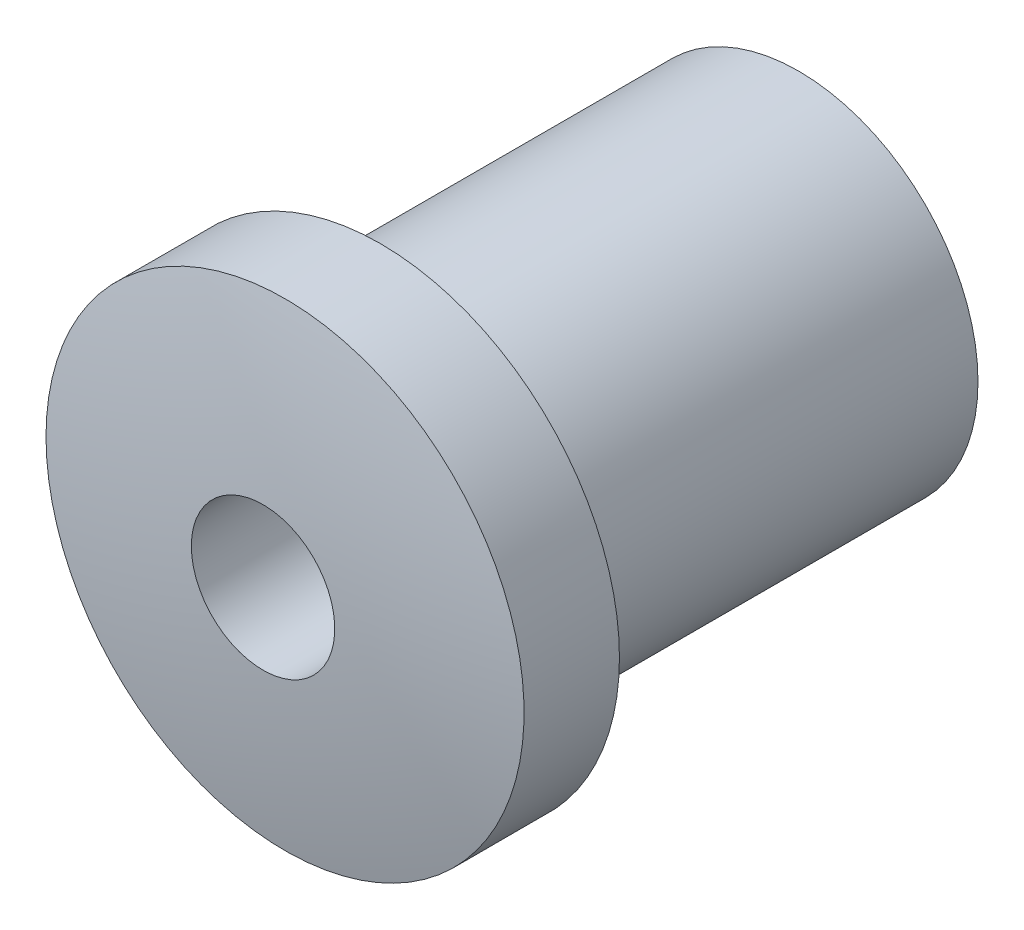
ISO-10303-21;
HEADER;
FILE_DESCRIPTION(('STEP AP214'),'2;1');
FILE_NAME('part.step','',(''),(''),'','','');
FILE_SCHEMA(('AUTOMOTIVE_DESIGN { 1 0 10303 214 1 1 1 1 }'));
ENDSEC;
DATA;
#1=APPLICATION_CONTEXT('core data for automotive mechanical design processes');
#2=APPLICATION_PROTOCOL_DEFINITION('international standard','automotive_design',2000,#1);
#3=PRODUCT_CONTEXT('',#1,'mechanical');
#4=PRODUCT('Part','Part','',(#3));
#5=PRODUCT_RELATED_PRODUCT_CATEGORY('part','',(#4));
#6=PRODUCT_DEFINITION_FORMATION('','',#4);
#7=PRODUCT_DEFINITION_CONTEXT('part definition',#1,'design');
#8=PRODUCT_DEFINITION('design','',#6,#7);
#9=PRODUCT_DEFINITION_SHAPE('','',#8);
#10=(LENGTH_UNIT() NAMED_UNIT(*) SI_UNIT(.MILLI.,.METRE.));
#11=(NAMED_UNIT(*) PLANE_ANGLE_UNIT() SI_UNIT($,.RADIAN.));
#12=(NAMED_UNIT(*) SI_UNIT($,.STERADIAN.) SOLID_ANGLE_UNIT());
#13=UNCERTAINTY_MEASURE_WITH_UNIT(LENGTH_MEASURE(1.E-05),#10,'distance_accuracy_value','');
#14=(GEOMETRIC_REPRESENTATION_CONTEXT(3) GLOBAL_UNCERTAINTY_ASSIGNED_CONTEXT((#13)) GLOBAL_UNIT_ASSIGNED_CONTEXT((#10,
#11,#12)) REPRESENTATION_CONTEXT('',''));
#15=CARTESIAN_POINT('',(0.,0.,0.));
#16=DIRECTION('',(0.,0.,1.));
#17=DIRECTION('',(1.,0.,0.));
#18=AXIS2_PLACEMENT_3D('',#15,#16,#17);
#19=CARTESIAN_POINT('',(0.,0.,35.));
#20=DIRECTION('',(0.,0.,-1.));
#21=DIRECTION('',(-1.,0.,0.));
#22=AXIS2_PLACEMENT_3D('',#19,#20,#21);
#23=CYLINDRICAL_SURFACE('',#22,15.);
#24=CARTESIAN_POINT('',(0.,0.,35.));
#25=DIRECTION('',(0.,0.,1.));
#26=DIRECTION('',(1.,0.,0.));
#27=AXIS2_PLACEMENT_3D('',#24,#25,#26);
#28=CIRCLE('',#27,15.);
#29=CARTESIAN_POINT('',(15.,0.,35.));
#30=VERTEX_POINT('',#29);
#31=EDGE_CURVE('E13',#30,#30,#28,.T.);
#32=ORIENTED_EDGE('',*,*,#31,.F.);
#33=EDGE_LOOP('',(#32));
#34=FACE_BOUND('',#33,.T.);
#35=CARTESIAN_POINT('',(0.,0.,0.));
#36=DIRECTION('',(0.,0.,1.));
#37=DIRECTION('',(1.,0.,0.));
#38=AXIS2_PLACEMENT_3D('',#35,#36,#37);
#39=CIRCLE('',#38,15.);
#40=CARTESIAN_POINT('',(15.,0.,0.));
#41=VERTEX_POINT('',#40);
#42=EDGE_CURVE('E56',#41,#41,#39,.T.);
#43=ORIENTED_EDGE('',*,*,#42,.T.);
#44=EDGE_LOOP('',(#43));
#45=FACE_BOUND('',#44,.T.);
#46=ADVANCED_FACE('F53',(#34,#45),#23,.T.);
#47=CARTESIAN_POINT('',(0.,0.,0.));
#48=DIRECTION('',(0.,0.,1.));
#49=DIRECTION('',(1.,0.,0.));
#50=AXIS2_PLACEMENT_3D('',#47,#48,#49);
#51=PLANE('',#50);
#52=DIRECTION('',(0.5,0.866025403784439,0.));
#53=VECTOR('',#52,1.);
#54=CARTESIAN_POINT('',(-11.0273901415219,0.,0.));
#55=LINE('',#54,#53);
#56=CARTESIAN_POINT('',(-11.0273901415219,0.,0.));
#57=VERTEX_POINT('',#56);
#58=CARTESIAN_POINT('',(-5.51369507076093,9.55,0.));
#59=VERTEX_POINT('',#58);
#60=EDGE_CURVE('E141',#57,#59,#55,.T.);
#61=ORIENTED_EDGE('',*,*,#60,.F.);
#62=DIRECTION('',(-0.5,0.866025403784439,0.));
#63=VECTOR('',#62,1.);
#64=CARTESIAN_POINT('',(-5.51369507076093,-9.55,0.));
#65=LINE('',#64,#63);
#66=CARTESIAN_POINT('',(-5.51369507076093,-9.55,0.));
#67=VERTEX_POINT('',#66);
#68=EDGE_CURVE('E67',#67,#57,#65,.T.);
#69=ORIENTED_EDGE('',*,*,#68,.F.);
#70=DIRECTION('',(-1.,0.,0.));
#71=VECTOR('',#70,1.);
#72=CARTESIAN_POINT('',(5.51369507076092,-9.55,0.));
#73=LINE('',#72,#71);
#74=CARTESIAN_POINT('',(5.51369507076092,-9.55,0.));
#75=VERTEX_POINT('',#74);
#76=EDGE_CURVE('E151',#75,#67,#73,.T.);
#77=ORIENTED_EDGE('',*,*,#76,.F.);
#78=DIRECTION('',(-0.5,-0.866025403784439,0.));
#79=VECTOR('',#78,1.);
#80=CARTESIAN_POINT('',(11.0273901415219,0.,0.));
#81=LINE('',#80,#79);
#82=CARTESIAN_POINT('',(11.0273901415219,0.,0.));
#83=VERTEX_POINT('',#82);
#84=EDGE_CURVE('E149',#83,#75,#81,.T.);
#85=ORIENTED_EDGE('',*,*,#84,.F.);
#86=DIRECTION('',(0.5,-0.866025403784438,0.));
#87=VECTOR('',#86,1.);
#88=CARTESIAN_POINT('',(5.51369507076093,9.55,0.));
#89=LINE('',#88,#87);
#90=CARTESIAN_POINT('',(5.51369507076093,9.55,0.));
#91=VERTEX_POINT('',#90);
#92=EDGE_CURVE('E115',#91,#83,#89,.T.);
#93=ORIENTED_EDGE('',*,*,#92,.F.);
#94=DIRECTION('',(1.,0.,0.));
#95=VECTOR('',#94,1.);
#96=CARTESIAN_POINT('',(-5.51369507076093,9.55,0.));
#97=LINE('',#96,#95);
#98=EDGE_CURVE('E145',#59,#91,#97,.T.);
#99=ORIENTED_EDGE('',*,*,#98,.F.);
#100=EDGE_LOOP('',(#61,#69,#77,#85,#93,#99));
#101=FACE_BOUND('',#100,.T.);
#102=ORIENTED_EDGE('',*,*,#42,.F.);
#103=EDGE_LOOP('',(#102));
#104=FACE_BOUND('',#103,.T.);
#105=ADVANCED_FACE('F164',(#101,#104),#51,.F.);
#106=CARTESIAN_POINT('',(-5.51369507076093,-9.55,12.));
#107=DIRECTION('',(-0.866025403784439,-0.5,0.));
#108=DIRECTION('',(0.5,-0.866025403784439,0.));
#109=AXIS2_PLACEMENT_3D('',#106,#107,#108);
#110=PLANE('',#109);
#111=ORIENTED_EDGE('',*,*,#68,.T.);
#112=DIRECTION('',(0.,0.,-1.));
#113=VECTOR('',#112,1.);
#114=CARTESIAN_POINT('',(-11.0273901415219,0.,12.));
#115=LINE('',#114,#113);
#116=CARTESIAN_POINT('',(-11.0273901415219,0.,12.));
#117=VERTEX_POINT('',#116);
#118=EDGE_CURVE('E97',#117,#57,#115,.T.);
#119=ORIENTED_EDGE('',*,*,#118,.F.);
#120=DIRECTION('',(-0.5,0.866025403784439,0.));
#121=VECTOR('',#120,1.);
#122=CARTESIAN_POINT('',(-5.51369507076093,-9.55,12.));
#123=LINE('',#122,#121);
#124=CARTESIAN_POINT('',(-5.51369507076093,-9.55,12.));
#125=VERTEX_POINT('',#124);
#126=EDGE_CURVE('E153',#125,#117,#123,.T.);
#127=ORIENTED_EDGE('',*,*,#126,.F.);
#128=DIRECTION('',(0.,0.,-1.));
#129=VECTOR('',#128,1.);
#130=CARTESIAN_POINT('',(-5.51369507076093,-9.55,12.));
#131=LINE('',#130,#129);
#132=EDGE_CURVE('E75',#125,#67,#131,.T.);
#133=ORIENTED_EDGE('',*,*,#132,.T.);
#134=EDGE_LOOP('',(#111,#119,#127,#133));
#135=FACE_BOUND('',#134,.T.);
#136=ADVANCED_FACE('F223',(#135),#110,.F.);
#137=CARTESIAN_POINT('',(5.51369507076092,-9.55,12.));
#138=DIRECTION('',(0.,-1.,0.));
#139=DIRECTION('',(0.,0.,-1.));
#140=AXIS2_PLACEMENT_3D('',#137,#138,#139);
#141=PLANE('',#140);
#142=ORIENTED_EDGE('',*,*,#76,.T.);
#143=ORIENTED_EDGE('',*,*,#132,.F.);
#144=DIRECTION('',(-1.,0.,0.));
#145=VECTOR('',#144,1.);
#146=CARTESIAN_POINT('',(5.51369507076092,-9.55,12.));
#147=LINE('',#146,#145);
#148=CARTESIAN_POINT('',(5.51369507076092,-9.55,12.));
#149=VERTEX_POINT('',#148);
#150=EDGE_CURVE('E127',#149,#125,#147,.T.);
#151=ORIENTED_EDGE('',*,*,#150,.F.);
#152=DIRECTION('',(0.,0.,-1.));
#153=VECTOR('',#152,1.);
#154=CARTESIAN_POINT('',(5.51369507076092,-9.55,12.));
#155=LINE('',#154,#153);
#156=EDGE_CURVE('E119',#149,#75,#155,.T.);
#157=ORIENTED_EDGE('',*,*,#156,.T.);
#158=EDGE_LOOP('',(#142,#143,#151,#157));
#159=FACE_BOUND('',#158,.T.);
#160=ADVANCED_FACE('F237',(#159),#141,.F.);
#161=CARTESIAN_POINT('',(11.0273901415219,0.,12.));
#162=DIRECTION('',(0.866025403784439,-0.5,0.));
#163=DIRECTION('',(0.5,0.866025403784439,0.));
#164=AXIS2_PLACEMENT_3D('',#161,#162,#163);
#165=PLANE('',#164);
#166=ORIENTED_EDGE('',*,*,#84,.T.);
#167=ORIENTED_EDGE('',*,*,#156,.F.);
#168=DIRECTION('',(-0.5,-0.866025403784439,0.));
#169=VECTOR('',#168,1.);
#170=CARTESIAN_POINT('',(11.0273901415219,0.,12.));
#171=LINE('',#170,#169);
#172=CARTESIAN_POINT('',(11.0273901415219,0.,12.));
#173=VERTEX_POINT('',#172);
#174=EDGE_CURVE('E123',#173,#149,#171,.T.);
#175=ORIENTED_EDGE('',*,*,#174,.F.);
#176=DIRECTION('',(0.,0.,-1.));
#177=VECTOR('',#176,1.);
#178=CARTESIAN_POINT('',(11.0273901415219,0.,12.));
#179=LINE('',#178,#177);
#180=EDGE_CURVE('E108',#173,#83,#179,.T.);
#181=ORIENTED_EDGE('',*,*,#180,.T.);
#182=EDGE_LOOP('',(#166,#167,#175,#181));
#183=FACE_BOUND('',#182,.T.);
#184=ADVANCED_FACE('F124',(#183),#165,.F.);
#185=CARTESIAN_POINT('',(5.51369507076093,9.55,12.));
#186=DIRECTION('',(0.866025403784439,0.5,0.));
#187=DIRECTION('',(-0.5,0.866025403784439,0.));
#188=AXIS2_PLACEMENT_3D('',#185,#186,#187);
#189=PLANE('',#188);
#190=ORIENTED_EDGE('',*,*,#92,.T.);
#191=ORIENTED_EDGE('',*,*,#180,.F.);
#192=DIRECTION('',(0.5,-0.866025403784438,0.));
#193=VECTOR('',#192,1.);
#194=CARTESIAN_POINT('',(5.51369507076093,9.55,12.));
#195=LINE('',#194,#193);
#196=CARTESIAN_POINT('',(5.51369507076093,9.55,12.));
#197=VERTEX_POINT('',#196);
#198=EDGE_CURVE('E112',#197,#173,#195,.T.);
#199=ORIENTED_EDGE('',*,*,#198,.F.);
#200=DIRECTION('',(0.,0.,-1.));
#201=VECTOR('',#200,1.);
#202=CARTESIAN_POINT('',(5.51369507076093,9.55,12.));
#203=LINE('',#202,#201);
#204=EDGE_CURVE('E120',#197,#91,#203,.T.);
#205=ORIENTED_EDGE('',*,*,#204,.T.);
#206=EDGE_LOOP('',(#190,#191,#199,#205));
#207=FACE_BOUND('',#206,.T.);
#208=ADVANCED_FACE('F110',(#207),#189,.F.);
#209=CARTESIAN_POINT('',(-5.51369507076093,9.55,12.));
#210=DIRECTION('',(0.,1.,0.));
#211=DIRECTION('',(-1.,0.,0.));
#212=AXIS2_PLACEMENT_3D('',#209,#210,#211);
#213=PLANE('',#212);
#214=ORIENTED_EDGE('',*,*,#98,.T.);
#215=ORIENTED_EDGE('',*,*,#204,.F.);
#216=DIRECTION('',(1.,0.,0.));
#217=VECTOR('',#216,1.);
#218=CARTESIAN_POINT('',(-5.51369507076093,9.55,12.));
#219=LINE('',#218,#217);
#220=CARTESIAN_POINT('',(-5.51369507076093,9.55,12.));
#221=VERTEX_POINT('',#220);
#222=EDGE_CURVE('E133',#221,#197,#219,.T.);
#223=ORIENTED_EDGE('',*,*,#222,.F.);
#224=DIRECTION('',(0.,0.,-1.));
#225=VECTOR('',#224,1.);
#226=CARTESIAN_POINT('',(-5.51369507076093,9.55,12.));
#227=LINE('',#226,#225);
#228=EDGE_CURVE('E157',#221,#59,#227,.T.);
#229=ORIENTED_EDGE('',*,*,#228,.T.);
#230=EDGE_LOOP('',(#214,#215,#223,#229));
#231=FACE_BOUND('',#230,.T.);
#232=ADVANCED_FACE('F168',(#231),#213,.F.);
#233=CARTESIAN_POINT('',(-11.0273901415219,0.,12.));
#234=DIRECTION('',(-0.866025403784438,0.5,0.));
#235=DIRECTION('',(-0.5,-0.866025403784439,0.));
#236=AXIS2_PLACEMENT_3D('',#233,#234,#235);
#237=PLANE('',#236);
#238=ORIENTED_EDGE('',*,*,#60,.T.);
#239=ORIENTED_EDGE('',*,*,#228,.F.);
#240=DIRECTION('',(0.5,0.866025403784439,0.));
#241=VECTOR('',#240,1.);
#242=CARTESIAN_POINT('',(-11.0273901415219,0.,12.));
#243=LINE('',#242,#241);
#244=EDGE_CURVE('E135',#117,#221,#243,.T.);
#245=ORIENTED_EDGE('',*,*,#244,.F.);
#246=ORIENTED_EDGE('',*,*,#118,.T.);
#247=EDGE_LOOP('',(#238,#239,#245,#246));
#248=FACE_BOUND('',#247,.T.);
#249=ADVANCED_FACE('F161',(#248),#237,.F.);
#250=CARTESIAN_POINT('',(0.,0.,12.));
#251=DIRECTION('',(0.,0.,-1.));
#252=DIRECTION('',(-1.,0.,0.));
#253=AXIS2_PLACEMENT_3D('',#250,#251,#252);
#254=PLANE('',#253);
#255=CARTESIAN_POINT('',(0.,0.,12.));
#256=DIRECTION('',(0.,0.,-1.));
#257=DIRECTION('',(-1.,0.,0.));
#258=AXIS2_PLACEMENT_3D('',#255,#256,#257);
#259=CIRCLE('',#258,6.25);
#260=CARTESIAN_POINT('',(-6.25,0.,12.));
#261=VERTEX_POINT('',#260);
#262=EDGE_CURVE('E173',#261,#261,#259,.T.);
#263=ORIENTED_EDGE('',*,*,#262,.F.);
#264=EDGE_LOOP('',(#263));
#265=FACE_BOUND('',#264,.T.);
#266=ORIENTED_EDGE('',*,*,#126,.T.);
#267=ORIENTED_EDGE('',*,*,#244,.T.);
#268=ORIENTED_EDGE('',*,*,#222,.T.);
#269=ORIENTED_EDGE('',*,*,#198,.T.);
#270=ORIENTED_EDGE('',*,*,#174,.T.);
#271=ORIENTED_EDGE('',*,*,#150,.T.);
#272=EDGE_LOOP('',(#266,#267,#268,#269,#270,#271));
#273=FACE_BOUND('',#272,.T.);
#274=ADVANCED_FACE('F130',(#265,#273),#254,.T.);
#275=CARTESIAN_POINT('',(0.,0.,12.));
#276=DIRECTION('',(0.,0.,-1.));
#277=DIRECTION('',(-1.,0.,0.));
#278=AXIS2_PLACEMENT_3D('',#275,#276,#277);
#279=CYLINDRICAL_SURFACE('',#278,6.25);
#280=CARTESIAN_POINT('',(0.,0.,35.));
#281=DIRECTION('',(0.,0.,-1.));
#282=DIRECTION('',(-1.,0.,0.));
#283=AXIS2_PLACEMENT_3D('',#280,#281,#282);
#284=CIRCLE('',#283,6.24999999999999);
#285=CARTESIAN_POINT('',(-6.24999999999999,0.,35.));
#286=VERTEX_POINT('',#285);
#287=EDGE_CURVE('E142',#286,#286,#284,.T.);
#288=ORIENTED_EDGE('',*,*,#287,.F.);
#289=EDGE_LOOP('',(#288));
#290=FACE_BOUND('',#289,.T.);
#291=ORIENTED_EDGE('',*,*,#262,.T.);
#292=EDGE_LOOP('',(#291));
#293=FACE_BOUND('',#292,.T.);
#294=ADVANCED_FACE('F207',(#290,#293),#279,.F.);
#295=CARTESIAN_POINT('',(0.,0.,35.));
#296=DIRECTION('',(0.,0.,1.));
#297=DIRECTION('',(1.,0.,0.));
#298=AXIS2_PLACEMENT_3D('',#295,#296,#297);
#299=PLANE('',#298);
#300=ORIENTED_EDGE('',*,*,#287,.T.);
#301=EDGE_LOOP('',(#300));
#302=FACE_BOUND('',#301,.T.);
#303=CARTESIAN_POINT('',(0.,0.,35.));
#304=DIRECTION('',(0.,0.,1.));
#305=DIRECTION('',(1.,0.,0.));
#306=AXIS2_PLACEMENT_3D('',#303,#304,#305);
#307=CIRCLE('',#306,5.99999999999999);
#308=CARTESIAN_POINT('',(5.99999999999999,0.,35.));
#309=VERTEX_POINT('',#308);
#310=EDGE_CURVE('E179',#309,#309,#307,.T.);
#311=ORIENTED_EDGE('',*,*,#310,.T.);
#312=EDGE_LOOP('',(#311));
#313=FACE_BOUND('',#312,.T.);
#314=ADVANCED_FACE('F204',(#302,#313),#299,.F.);
#315=ORIENTED_EDGE('',*,*,#31,.T.);
#316=EDGE_LOOP('',(#315));
#317=FACE_BOUND('',#316,.T.);
#318=CARTESIAN_POINT('',(0.,0.,35.));
#319=DIRECTION('',(0.,0.,1.));
#320=DIRECTION('',(1.,0.,0.));
#321=AXIS2_PLACEMENT_3D('',#318,#319,#320);
#322=CIRCLE('',#321,20.);
#323=CARTESIAN_POINT('',(20.,0.,35.));
#324=VERTEX_POINT('',#323);
#325=EDGE_CURVE('E176',#324,#324,#322,.T.);
#326=ORIENTED_EDGE('',*,*,#325,.F.);
#327=EDGE_LOOP('',(#326));
#328=FACE_BOUND('',#327,.T.);
#329=ADVANCED_FACE('F206',(#317,#328),#299,.F.);
#330=CARTESIAN_POINT('',(0.,0.,45.));
#331=DIRECTION('',(0.,0.,-1.));
#332=DIRECTION('',(-1.,0.,0.));
#333=AXIS2_PLACEMENT_3D('',#330,#331,#332);
#334=CYLINDRICAL_SURFACE('',#333,20.);
#335=CARTESIAN_POINT('',(0.,0.,42.9795897113271));
#336=DIRECTION('',(0.,0.,-1.));
#337=DIRECTION('',(-1.,0.,0.));
#338=AXIS2_PLACEMENT_3D('',#335,#336,#337);
#339=CIRCLE('',#338,20.);
#340=CARTESIAN_POINT('',(-20.,0.,42.9795897113271));
#341=VERTEX_POINT('',#340);
#342=EDGE_CURVE('E185',#341,#341,#339,.T.);
#343=ORIENTED_EDGE('',*,*,#342,.T.);
#344=EDGE_LOOP('',(#343));
#345=FACE_BOUND('',#344,.T.);
#346=ORIENTED_EDGE('',*,*,#325,.T.);
#347=EDGE_LOOP('',(#346));
#348=FACE_BOUND('',#347,.T.);
#349=ADVANCED_FACE('F189',(#345,#348),#334,.T.);
#350=CARTESIAN_POINT('',(0.,0.,45.));
#351=DIRECTION('',(0.,0.,-1.));
#352=DIRECTION('',(-1.,0.,0.));
#353=AXIS2_PLACEMENT_3D('',#350,#351,#352);
#354=CYLINDRICAL_SURFACE('',#353,5.99999999999999);
#355=CARTESIAN_POINT('',(0.,0.,44.8198377077422));
#356=DIRECTION('',(0.,0.,-1.));
#357=DIRECTION('',(-1.,0.,0.));
#358=AXIS2_PLACEMENT_3D('',#355,#356,#357);
#359=CIRCLE('',#358,5.99999999999999);
#360=CARTESIAN_POINT('',(-5.99999999999989,0.,44.8198377077423));
#361=VERTEX_POINT('',#360);
#362=EDGE_CURVE('E182',#361,#361,#359,.T.);
#363=ORIENTED_EDGE('',*,*,#362,.F.);
#364=EDGE_LOOP('',(#363));
#365=FACE_BOUND('',#364,.T.);
#366=ORIENTED_EDGE('',*,*,#310,.F.);
#367=EDGE_LOOP('',(#366));
#368=FACE_BOUND('',#367,.T.);
#369=ADVANCED_FACE('F195',(#365,#368),#354,.F.);
#370=CARTESIAN_POINT('',(0.,0.,-55.));
#371=DIRECTION('',(0.,0.,-1.));
#372=DIRECTION('',(-1.,0.,0.));
#373=AXIS2_PLACEMENT_3D('',#370,#371,#372);
#374=SPHERICAL_SURFACE('',#373,100.);
#375=CARTESIAN_POINT('',(-20.,0.,42.9795897113271));
#376=CARTESIAN_POINT('',(-19.855763978677,0.,43.0090317682151));
#377=CARTESIAN_POINT('',(-19.711462943883,0.,43.0381553253553));
#378=CARTESIAN_POINT('',(-19.4227336637206,0.,43.0957648819291));
#379=CARTESIAN_POINT('',(-19.2783054183522,0.,43.1242508813626));
#380=CARTESIAN_POINT('',(-18.9893245334086,0.,43.1805847643114));
#381=CARTESIAN_POINT('',(-18.8447718938334,0.,43.2084326478267));
#382=CARTESIAN_POINT('',(-18.5555450399346,0.,43.263489756505));
#383=CARTESIAN_POINT('',(-18.4108708256111,0.,43.290698981668));
#384=CARTESIAN_POINT('',(-18.1214036438672,0.,43.3444782427714));
#385=CARTESIAN_POINT('',(-17.9766106764469,0.,43.3710482787118));
#386=CARTESIAN_POINT('',(-17.686908812525,0.,43.4235486432051));
#387=CARTESIAN_POINT('',(-17.5419999160233,0.,43.449478971758));
#388=CARTESIAN_POINT('',(-17.2520690202023,0.,43.5006994157245));
#389=CARTESIAN_POINT('',(-17.1070470208829,0.,43.5259895311379));
#390=CARTESIAN_POINT('',(-16.8168927478995,0.,43.575929055577));
#391=CARTESIAN_POINT('',(-16.6717604742355,0.,43.6005784646027));
#392=CARTESIAN_POINT('',(-16.3813884831856,0.,43.6492360955093));
#393=CARTESIAN_POINT('',(-16.2361487657997,0.,43.6732443173902));
#394=CARTESIAN_POINT('',(-15.9455647200249,0.,43.7206191057575));
#395=CARTESIAN_POINT('',(-15.8002203916359,0.,43.7439856722438));
#396=CARTESIAN_POINT('',(-15.5094299586136,0.,43.7900766940861));
#397=CARTESIAN_POINT('',(-15.3639838539804,0.,43.8128011494421));
#398=CARTESIAN_POINT('',(-15.0729927052136,0.,43.8576075058118));
#399=CARTESIAN_POINT('',(-14.9274476610801,0.,43.8796894068255));
#400=CARTESIAN_POINT('',(-14.6362614719864,0.,43.9232102238307));
#401=CARTESIAN_POINT('',(-14.4906203270262,0.,43.9446491398223));
#402=CARTESIAN_POINT('',(-14.1992447768271,0.,43.9868835686441));
#403=CARTESIAN_POINT('',(-14.0535103715882,0.,44.0076790814744));
#404=CARTESIAN_POINT('',(-13.7619511431986,0.,44.0486262983832));
#405=CARTESIAN_POINT('',(-13.6161263200479,0.,44.0687780024618));
#406=CARTESIAN_POINT('',(-13.324389099965,0.,44.1084372088335));
#407=CARTESIAN_POINT('',(-13.1784767030328,0.,44.1279447111266));
#408=CARTESIAN_POINT('',(-12.8865671812254,0.,44.1663151334581));
#409=CARTESIAN_POINT('',(-12.7405700563502,0.,44.1851780534964));
#410=CARTESIAN_POINT('',(-12.4484939261475,0.,44.2222589434207));
#411=CARTESIAN_POINT('',(-12.3024149208201,0.,44.2404769133066));
#412=CARTESIAN_POINT('',(-12.010177878801,0.,44.2762675476074));
#413=CARTESIAN_POINT('',(-11.8640198421093,0.,44.2938402120222));
#414=CARTESIAN_POINT('',(-11.5716275879909,0.,44.328339892648));
#415=CARTESIAN_POINT('',(-11.4253933705642,0.,44.345266908859));
#416=CARTESIAN_POINT('',(-11.1328516070908,0.,44.3784749629368));
#417=CARTESIAN_POINT('',(-10.9865440610442,0.,44.3947560008036));
#418=CARTESIAN_POINT('',(-10.6938584938763,0.,44.426671780652));
#419=CARTESIAN_POINT('',(-10.547480472755,0.,44.4423065226336));
#420=CARTESIAN_POINT('',(-10.2546568103576,0.,44.4729294057752));
#421=CARTESIAN_POINT('',(-10.1082111690815,0.,44.4879175469354));
#422=CARTESIAN_POINT('',(-9.81525512261311,0.,44.5172469361094));
#423=CARTESIAN_POINT('',(-9.66874471742081,0.,44.5315881841233));
#424=CARTESIAN_POINT('',(-9.37566200062179,0.,44.5596235072966));
#425=CARTESIAN_POINT('',(-9.22908968901507,0.,44.5733175824559));
#426=CARTESIAN_POINT('',(-8.93588601809648,0.,44.6000582928353));
#427=CARTESIAN_POINT('',(-8.78925465878461,0.,44.6131049280553));
#428=CARTESIAN_POINT('',(-8.4959357523163,0.,44.6385505040941));
#429=CARTESIAN_POINT('',(-8.34924820515987,0.,44.6509494449128));
#430=CARTESIAN_POINT('',(-8.05581978396007,0.,44.6750993903369));
#431=CARTESIAN_POINT('',(-7.9090789099167,0.,44.6868503949423));
#432=CARTESIAN_POINT('',(-7.61554669693651,0.,44.7097042386998));
#433=CARTESIAN_POINT('',(-7.46875535799968,0.,44.7208070778519));
#434=CARTESIAN_POINT('',(-7.17512507822598,0.,44.7423643743476));
#435=CARTESIAN_POINT('',(-7.02828613738912,0.,44.7528188316913));
#436=CARTESIAN_POINT('',(-6.73456351767859,0.,44.7730791599529));
#437=CARTESIAN_POINT('',(-6.58767983880493,0.,44.7828850308706));
#438=CARTESIAN_POINT('',(-6.2938706079754,0.,44.8018479977031));
#439=CARTESIAN_POINT('',(-6.14694505601955,0.,44.8110050936177));
#440=CARTESIAN_POINT('',(-5.99999999999989,0.,44.8198377077423));
#441=B_SPLINE_CURVE_WITH_KNOTS('',3,(#375,#376,#377,#378,#379,#380,#381,#382,#383,#384,#385,
#386,#387,#388,#389,#390,#391,#392,#393,#394,#395,#396,#397,#398,#399,#400,#401,#402,#403,#404,
#405,#406,#407,#408,#409,#410,#411,#412,#413,#414,#415,#416,#417,#418,#419,#420,#421,#422,#423,
#424,#425,#426,#427,#428,#429,#430,#431,#432,#433,#434,#435,#436,#437,#438,#439,#440),
.UNSPECIFIED.,.F.,.F.,(4,2,2,2,2,2,2,2,2,2,2,2,2,2,2,2,2,2,2,2,2,2,2,2,2,2,2,2,2,2,2,2,4),(0.,
0.441630460933812,0.883260921867623,1.32489138280146,1.76652184373527,2.20815230466908,
2.64978276560291,3.09141322653673,3.53304368747054,3.97467414840435,4.41630460933816,
4.85793507027199,5.29956553120581,5.74119599213962,6.18282645307345,6.62445691400727,
7.06608737494108,7.50771783587489,7.9493482968087,8.39097875774253,8.83260921867634,
9.27423967961016,9.71587014054399,10.1575006014778,10.5991310624116,11.0407615233454,
11.4823919842792,11.9240224452131,12.3656529061469,12.8072833670807,13.2489138280145,
13.6905442889483,14.1321747498821),.UNSPECIFIED.);
#442=EDGE_CURVE('BSEAM192',#341,#361,#441,.T.);
#443=ORIENTED_EDGE('',*,*,#342,.F.);
#444=ORIENTED_EDGE('',*,*,#362,.T.);
#445=ORIENTED_EDGE('',*,*,#442,.T.);
#446=ORIENTED_EDGE('',*,*,#442,.F.);
#447=EDGE_LOOP('',(#443,#445,#444,#446));
#448=FACE_BOUND('',#447,.T.);
#449=ADVANCED_FACE('F192',(#448),#374,.T.);
#450=CLOSED_SHELL('',(#46,#105,#136,#160,#184,#208,#232,#249,#274,#294,#314,#329,#349,#369,#449));
#451=MANIFOLD_SOLID_BREP('B2',#450);
#452=ADVANCED_BREP_SHAPE_REPRESENTATION('',(#18,#451),#14);
#453=SHAPE_DEFINITION_REPRESENTATION(#9,#452);
ENDSEC;
END-ISO-10303-21;
